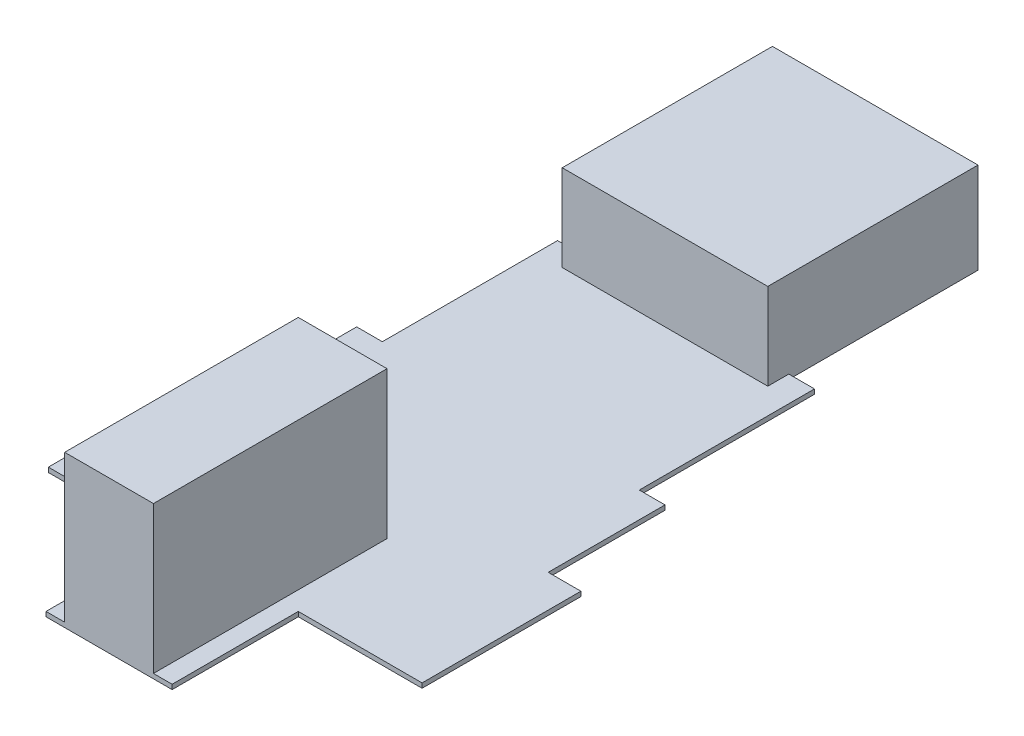
ISO-10303-21;
HEADER;
FILE_DESCRIPTION(('STEP AP214'),'2;1');
FILE_NAME('part.step','',(''),(''),'','','');
FILE_SCHEMA(('AUTOMOTIVE_DESIGN { 1 0 10303 214 1 1 1 1 }'));
ENDSEC;
DATA;
#1=APPLICATION_CONTEXT('core data for automotive mechanical design processes');
#2=APPLICATION_PROTOCOL_DEFINITION('international standard','automotive_design',2000,#1);
#3=PRODUCT_CONTEXT('',#1,'mechanical');
#4=PRODUCT('Part','Part','',(#3));
#5=PRODUCT_RELATED_PRODUCT_CATEGORY('part','',(#4));
#6=PRODUCT_DEFINITION_FORMATION('','',#4);
#7=PRODUCT_DEFINITION_CONTEXT('part definition',#1,'design');
#8=PRODUCT_DEFINITION('design','',#6,#7);
#9=PRODUCT_DEFINITION_SHAPE('','',#8);
#10=(LENGTH_UNIT() NAMED_UNIT(*) SI_UNIT(.MILLI.,.METRE.));
#11=(NAMED_UNIT(*) PLANE_ANGLE_UNIT() SI_UNIT($,.RADIAN.));
#12=(NAMED_UNIT(*) SI_UNIT($,.STERADIAN.) SOLID_ANGLE_UNIT());
#13=UNCERTAINTY_MEASURE_WITH_UNIT(LENGTH_MEASURE(1.E-05),#10,'distance_accuracy_value','');
#14=(GEOMETRIC_REPRESENTATION_CONTEXT(3) GLOBAL_UNCERTAINTY_ASSIGNED_CONTEXT((#13)) GLOBAL_UNIT_ASSIGNED_CONTEXT((#10,
#11,#12)) REPRESENTATION_CONTEXT('',''));
#15=CARTESIAN_POINT('',(0.,0.,0.));
#16=DIRECTION('',(0.,0.,1.));
#17=DIRECTION('',(1.,0.,0.));
#18=AXIS2_PLACEMENT_3D('',#15,#16,#17);
#19=CARTESIAN_POINT('',(0.,2.,0.));
#20=DIRECTION('',(0.,1.,0.));
#21=DIRECTION('',(0.,0.,1.));
#22=AXIS2_PLACEMENT_3D('',#19,#20,#21);
#23=PLANE('',#22);
#24=DIRECTION('',(0.,0.,-1.));
#25=VECTOR('',#24,1.);
#26=CARTESIAN_POINT('',(43.9999999999993,2.,-328.));
#27=LINE('',#26,#25);
#28=CARTESIAN_POINT('',(43.9999999999993,2.,-238.));
#29=VERTEX_POINT('',#28);
#30=CARTESIAN_POINT('',(43.9999999999994,2.,-247.));
#31=VERTEX_POINT('',#30);
#32=EDGE_CURVE('E52',#29,#31,#27,.T.);
#33=ORIENTED_EDGE('',*,*,#32,.F.);
#34=DIRECTION('',(-1.,0.,0.));
#35=VECTOR('',#34,1.);
#36=CARTESIAN_POINT('',(43.9999999999993,1.99999999999999,-238.));
#37=LINE('',#36,#35);
#38=CARTESIAN_POINT('',(-44.0000000000014,2.,-238.));
#39=VERTEX_POINT('',#38);
#40=EDGE_CURVE('E57',#29,#39,#37,.T.);
#41=ORIENTED_EDGE('',*,*,#40,.T.);
#42=DIRECTION('',(0.,0.,-1.));
#43=VECTOR('',#42,1.);
#44=CARTESIAN_POINT('',(-44.0000000000014,2.,-328.));
#45=LINE('',#44,#43);
#46=CARTESIAN_POINT('',(-44.0000000000014,1.99999999999999,-247.));
#47=VERTEX_POINT('',#46);
#48=EDGE_CURVE('E238',#39,#47,#45,.T.);
#49=ORIENTED_EDGE('',*,*,#48,.T.);
#50=DIRECTION('',(-1.,0.,0.));
#51=VECTOR('',#50,1.);
#52=CARTESIAN_POINT('',(-55.0000000000011,2.,-247.));
#53=LINE('',#52,#51);
#54=CARTESIAN_POINT('',(-55.0000000000011,2.,-247.));
#55=VERTEX_POINT('',#54);
#56=EDGE_CURVE('E407',#47,#55,#53,.T.);
#57=ORIENTED_EDGE('',*,*,#56,.T.);
#58=DIRECTION('',(0.,0.,1.));
#59=VECTOR('',#58,1.);
#60=CARTESIAN_POINT('',(-55.0000000000006,2.,-172.));
#61=LINE('',#60,#59);
#62=CARTESIAN_POINT('',(-55.0000000000006,2.,-172.));
#63=VERTEX_POINT('',#62);
#64=EDGE_CURVE('E367',#55,#63,#61,.T.);
#65=ORIENTED_EDGE('',*,*,#64,.T.);
#66=DIRECTION('',(-1.,0.,0.));
#67=VECTOR('',#66,1.);
#68=CARTESIAN_POINT('',(-66.0000000000006,2.,-172.));
#69=LINE('',#68,#67);
#70=CARTESIAN_POINT('',(-66.0000000000006,2.,-172.));
#71=VERTEX_POINT('',#70);
#72=EDGE_CURVE('E294',#63,#71,#69,.T.);
#73=ORIENTED_EDGE('',*,*,#72,.T.);
#74=DIRECTION('',(0.,0.,1.));
#75=VECTOR('',#74,1.);
#76=CARTESIAN_POINT('',(-66.0000000000004,2.,-122.));
#77=LINE('',#76,#75);
#78=CARTESIAN_POINT('',(-66.0000000000004,2.,-122.));
#79=VERTEX_POINT('',#78);
#80=EDGE_CURVE('E297',#71,#79,#77,.T.);
#81=ORIENTED_EDGE('',*,*,#80,.T.);
#82=DIRECTION('',(-1.,0.,0.));
#83=VECTOR('',#82,1.);
#84=CARTESIAN_POINT('',(-80.0000000000004,2.,-122.));
#85=LINE('',#84,#83);
#86=CARTESIAN_POINT('',(-80.0000000000004,2.,-122.));
#87=VERTEX_POINT('',#86);
#88=EDGE_CURVE('E300',#79,#87,#85,.T.);
#89=ORIENTED_EDGE('',*,*,#88,.T.);
#90=DIRECTION('',(0.,0.,1.));
#91=VECTOR('',#90,1.);
#92=CARTESIAN_POINT('',(-80.0000000000002,2.,-53.9999999999996));
#93=LINE('',#92,#91);
#94=CARTESIAN_POINT('',(-80.0000000000002,2.,-53.9999999999996));
#95=VERTEX_POINT('',#94);
#96=EDGE_CURVE('E302',#87,#95,#93,.T.);
#97=ORIENTED_EDGE('',*,*,#96,.T.);
#98=DIRECTION('',(1.,0.,0.));
#99=VECTOR('',#98,1.);
#100=CARTESIAN_POINT('',(-27.0000000000002,2.,-54.));
#101=LINE('',#100,#99);
#102=CARTESIAN_POINT('',(-27.0000000000002,2.,-54.));
#103=VERTEX_POINT('',#102);
#104=EDGE_CURVE('E304',#95,#103,#101,.T.);
#105=ORIENTED_EDGE('',*,*,#104,.T.);
#106=DIRECTION('',(0.,0.,1.));
#107=VECTOR('',#106,1.);
#108=CARTESIAN_POINT('',(-27.,2.,2.22044604925031E-13));
#109=LINE('',#108,#107);
#110=CARTESIAN_POINT('',(-27.,2.,2.22044604925031E-13));
#111=VERTEX_POINT('',#110);
#112=EDGE_CURVE('E306',#103,#111,#109,.T.);
#113=ORIENTED_EDGE('',*,*,#112,.T.);
#114=DIRECTION('',(1.,0.,0.));
#115=VECTOR('',#114,1.);
#116=CARTESIAN_POINT('',(-27.,2.,2.22044604925031E-13));
#117=LINE('',#116,#115);
#118=CARTESIAN_POINT('',(-19.,2.,1.89149107899101E-13));
#119=VERTEX_POINT('',#118);
#120=EDGE_CURVE('E263',#111,#119,#117,.T.);
#121=ORIENTED_EDGE('',*,*,#120,.T.);
#122=DIRECTION('',(0.,0.,-1.));
#123=VECTOR('',#122,1.);
#124=CARTESIAN_POINT('',(-19.,2.,0.));
#125=LINE('',#124,#123);
#126=CARTESIAN_POINT('',(-19.,2.,-100.));
#127=VERTEX_POINT('',#126);
#128=EDGE_CURVE('E253',#119,#127,#125,.T.);
#129=ORIENTED_EDGE('',*,*,#128,.T.);
#130=DIRECTION('',(-1.,0.,0.));
#131=VECTOR('',#130,1.);
#132=CARTESIAN_POINT('',(19.,2.,-100.));
#133=LINE('',#132,#131);
#134=CARTESIAN_POINT('',(19.,2.,-100.));
#135=VERTEX_POINT('',#134);
#136=EDGE_CURVE('E290',#135,#127,#133,.T.);
#137=ORIENTED_EDGE('',*,*,#136,.F.);
#138=DIRECTION('',(0.,0.,-1.));
#139=VECTOR('',#138,1.);
#140=CARTESIAN_POINT('',(19.,2.,0.));
#141=LINE('',#140,#139);
#142=CARTESIAN_POINT('',(19.,2.,0.));
#143=VERTEX_POINT('',#142);
#144=EDGE_CURVE('E282',#143,#135,#141,.T.);
#145=ORIENTED_EDGE('',*,*,#144,.F.);
#146=CARTESIAN_POINT('',(27.,2.,0.));
#147=VERTEX_POINT('',#146);
#148=EDGE_CURVE('E308',#143,#147,#117,.T.);
#149=ORIENTED_EDGE('',*,*,#148,.T.);
#150=DIRECTION('',(0.,0.,-1.));
#151=VECTOR('',#150,1.);
#152=CARTESIAN_POINT('',(27.,2.,0.));
#153=LINE('',#152,#151);
#154=CARTESIAN_POINT('',(26.9999999999998,2.,-54.));
#155=VERTEX_POINT('',#154);
#156=EDGE_CURVE('E311',#147,#155,#153,.T.);
#157=ORIENTED_EDGE('',*,*,#156,.T.);
#158=DIRECTION('',(1.,0.,0.));
#159=VECTOR('',#158,1.);
#160=CARTESIAN_POINT('',(26.9999999999998,2.,-54.));
#161=LINE('',#160,#159);
#162=CARTESIAN_POINT('',(79.9999999999998,2.,-54.));
#163=VERTEX_POINT('',#162);
#164=EDGE_CURVE('E420',#155,#163,#161,.T.);
#165=ORIENTED_EDGE('',*,*,#164,.T.);
#166=DIRECTION('',(0.,0.,-1.));
#167=VECTOR('',#166,1.);
#168=CARTESIAN_POINT('',(79.9999999999998,2.,-54.));
#169=LINE('',#168,#167);
#170=CARTESIAN_POINT('',(79.9999999999996,2.,-122.));
#171=VERTEX_POINT('',#170);
#172=EDGE_CURVE('E419',#163,#171,#169,.T.);
#173=ORIENTED_EDGE('',*,*,#172,.T.);
#174=DIRECTION('',(-1.,0.,0.));
#175=VECTOR('',#174,1.);
#176=CARTESIAN_POINT('',(79.9999999999996,2.,-122.));
#177=LINE('',#176,#175);
#178=CARTESIAN_POINT('',(65.9999999999996,2.,-122.));
#179=VERTEX_POINT('',#178);
#180=EDGE_CURVE('E417',#171,#179,#177,.T.);
#181=ORIENTED_EDGE('',*,*,#180,.T.);
#182=DIRECTION('',(0.,0.,-1.));
#183=VECTOR('',#182,1.);
#184=CARTESIAN_POINT('',(65.9999999999996,2.,-122.));
#185=LINE('',#184,#183);
#186=CARTESIAN_POINT('',(65.9999999999994,2.,-172.));
#187=VERTEX_POINT('',#186);
#188=EDGE_CURVE('E415',#179,#187,#185,.T.);
#189=ORIENTED_EDGE('',*,*,#188,.T.);
#190=DIRECTION('',(-1.,0.,0.));
#191=VECTOR('',#190,1.);
#192=CARTESIAN_POINT('',(65.9999999999994,2.,-172.));
#193=LINE('',#192,#191);
#194=CARTESIAN_POINT('',(54.9999999999994,2.,-172.));
#195=VERTEX_POINT('',#194);
#196=EDGE_CURVE('E413',#187,#195,#193,.T.);
#197=ORIENTED_EDGE('',*,*,#196,.T.);
#198=DIRECTION('',(0.,0.,-1.));
#199=VECTOR('',#198,1.);
#200=CARTESIAN_POINT('',(54.9999999999994,2.,-172.));
#201=LINE('',#200,#199);
#202=CARTESIAN_POINT('',(54.9999999999994,2.,-247.));
#203=VERTEX_POINT('',#202);
#204=EDGE_CURVE('E411',#195,#203,#201,.T.);
#205=ORIENTED_EDGE('',*,*,#204,.T.);
#206=DIRECTION('',(-1.,0.,0.));
#207=VECTOR('',#206,1.);
#208=CARTESIAN_POINT('',(54.9999999999994,2.,-247.));
#209=LINE('',#208,#207);
#210=EDGE_CURVE('E409',#203,#31,#209,.T.);
#211=ORIENTED_EDGE('',*,*,#210,.T.);
#212=EDGE_LOOP('',(#33,#41,#49,#57,#65,#73,#81,#89,#97,#105,#113,#121,#129,#137,#145,#149,#157,
#165,#173,#181,#189,#197,#205,#211));
#213=FACE_BOUND('',#212,.T.);
#214=ADVANCED_FACE('F35',(#213),#23,.T.);
#215=CARTESIAN_POINT('',(-66.0000000000006,2.,-172.));
#216=DIRECTION('',(0.,0.,1.));
#217=DIRECTION('',(1.,0.,0.));
#218=AXIS2_PLACEMENT_3D('',#215,#216,#217);
#219=PLANE('',#218);
#220=DIRECTION('',(-1.,0.,0.));
#221=VECTOR('',#220,1.);
#222=CARTESIAN_POINT('',(-66.0000000000006,0.,-172.));
#223=LINE('',#222,#221);
#224=CARTESIAN_POINT('',(-55.0000000000006,0.,-172.));
#225=VERTEX_POINT('',#224);
#226=CARTESIAN_POINT('',(-66.0000000000006,0.,-172.));
#227=VERTEX_POINT('',#226);
#228=EDGE_CURVE('E293',#225,#227,#223,.T.);
#229=ORIENTED_EDGE('',*,*,#228,.T.);
#230=DIRECTION('',(0.,-1.,0.));
#231=VECTOR('',#230,1.);
#232=CARTESIAN_POINT('',(-66.0000000000006,2.,-172.));
#233=LINE('',#232,#231);
#234=EDGE_CURVE('E11',#71,#227,#233,.T.);
#235=ORIENTED_EDGE('',*,*,#234,.F.);
#236=ORIENTED_EDGE('',*,*,#72,.F.);
#237=DIRECTION('',(0.,-1.,0.));
#238=VECTOR('',#237,1.);
#239=CARTESIAN_POINT('',(-55.0000000000006,2.,-172.));
#240=LINE('',#239,#238);
#241=EDGE_CURVE('E364',#63,#225,#240,.T.);
#242=ORIENTED_EDGE('',*,*,#241,.T.);
#243=EDGE_LOOP('',(#229,#235,#236,#242));
#244=FACE_BOUND('',#243,.T.);
#245=ADVANCED_FACE('F37',(#244),#219,.F.);
#246=CARTESIAN_POINT('',(-66.0000000000004,2.,-122.));
#247=DIRECTION('',(1.,0.,0.));
#248=DIRECTION('',(0.,0.,-1.));
#249=AXIS2_PLACEMENT_3D('',#246,#247,#248);
#250=PLANE('',#249);
#251=DIRECTION('',(0.,0.,1.));
#252=VECTOR('',#251,1.);
#253=CARTESIAN_POINT('',(-66.0000000000004,0.,-122.));
#254=LINE('',#253,#252);
#255=CARTESIAN_POINT('',(-66.0000000000004,0.,-122.));
#256=VERTEX_POINT('',#255);
#257=EDGE_CURVE('E402',#227,#256,#254,.T.);
#258=ORIENTED_EDGE('',*,*,#257,.T.);
#259=DIRECTION('',(0.,-1.,0.));
#260=VECTOR('',#259,1.);
#261=CARTESIAN_POINT('',(-66.0000000000004,2.,-122.));
#262=LINE('',#261,#260);
#263=EDGE_CURVE('E44',#79,#256,#262,.T.);
#264=ORIENTED_EDGE('',*,*,#263,.F.);
#265=ORIENTED_EDGE('',*,*,#80,.F.);
#266=ORIENTED_EDGE('',*,*,#234,.T.);
#267=EDGE_LOOP('',(#258,#264,#265,#266));
#268=FACE_BOUND('',#267,.T.);
#269=ADVANCED_FACE('F487',(#268),#250,.F.);
#270=CARTESIAN_POINT('',(-80.0000000000004,2.,-122.));
#271=DIRECTION('',(0.,0.,1.));
#272=DIRECTION('',(1.,0.,0.));
#273=AXIS2_PLACEMENT_3D('',#270,#271,#272);
#274=PLANE('',#273);
#275=DIRECTION('',(-1.,0.,0.));
#276=VECTOR('',#275,1.);
#277=CARTESIAN_POINT('',(-80.0000000000004,0.,-122.));
#278=LINE('',#277,#276);
#279=CARTESIAN_POINT('',(-80.0000000000004,0.,-122.));
#280=VERTEX_POINT('',#279);
#281=EDGE_CURVE('E400',#256,#280,#278,.T.);
#282=ORIENTED_EDGE('',*,*,#281,.T.);
#283=DIRECTION('',(0.,-1.,0.));
#284=VECTOR('',#283,1.);
#285=CARTESIAN_POINT('',(-80.0000000000004,2.,-122.));
#286=LINE('',#285,#284);
#287=EDGE_CURVE('E320',#87,#280,#286,.T.);
#288=ORIENTED_EDGE('',*,*,#287,.F.);
#289=ORIENTED_EDGE('',*,*,#88,.F.);
#290=ORIENTED_EDGE('',*,*,#263,.T.);
#291=EDGE_LOOP('',(#282,#288,#289,#290));
#292=FACE_BOUND('',#291,.T.);
#293=ADVANCED_FACE('F490',(#292),#274,.F.);
#294=CARTESIAN_POINT('',(-80.0000000000002,2.,-53.9999999999996));
#295=DIRECTION('',(1.,0.,0.));
#296=DIRECTION('',(0.,0.,-1.));
#297=AXIS2_PLACEMENT_3D('',#294,#295,#296);
#298=PLANE('',#297);
#299=DIRECTION('',(0.,0.,1.));
#300=VECTOR('',#299,1.);
#301=CARTESIAN_POINT('',(-80.0000000000002,0.,-53.9999999999996));
#302=LINE('',#301,#300);
#303=CARTESIAN_POINT('',(-80.0000000000002,0.,-53.9999999999996));
#304=VERTEX_POINT('',#303);
#305=EDGE_CURVE('E398',#280,#304,#302,.T.);
#306=ORIENTED_EDGE('',*,*,#305,.T.);
#307=DIRECTION('',(0.,-1.,0.));
#308=VECTOR('',#307,1.);
#309=CARTESIAN_POINT('',(-80.0000000000002,2.,-53.9999999999996));
#310=LINE('',#309,#308);
#311=EDGE_CURVE('E323',#95,#304,#310,.T.);
#312=ORIENTED_EDGE('',*,*,#311,.F.);
#313=ORIENTED_EDGE('',*,*,#96,.F.);
#314=ORIENTED_EDGE('',*,*,#287,.T.);
#315=EDGE_LOOP('',(#306,#312,#313,#314));
#316=FACE_BOUND('',#315,.T.);
#317=ADVANCED_FACE('F495',(#316),#298,.F.);
#318=CARTESIAN_POINT('',(-27.0000000000002,2.,-54.));
#319=DIRECTION('',(0.,0.,-1.));
#320=DIRECTION('',(-1.,0.,0.));
#321=AXIS2_PLACEMENT_3D('',#318,#319,#320);
#322=PLANE('',#321);
#323=DIRECTION('',(1.,0.,0.));
#324=VECTOR('',#323,1.);
#325=CARTESIAN_POINT('',(-27.0000000000002,0.,-54.));
#326=LINE('',#325,#324);
#327=CARTESIAN_POINT('',(-27.0000000000002,0.,-54.));
#328=VERTEX_POINT('',#327);
#329=EDGE_CURVE('E396',#304,#328,#326,.T.);
#330=ORIENTED_EDGE('',*,*,#329,.T.);
#331=DIRECTION('',(0.,-1.,0.));
#332=VECTOR('',#331,1.);
#333=CARTESIAN_POINT('',(-27.0000000000002,2.,-54.));
#334=LINE('',#333,#332);
#335=EDGE_CURVE('E326',#103,#328,#334,.T.);
#336=ORIENTED_EDGE('',*,*,#335,.F.);
#337=ORIENTED_EDGE('',*,*,#104,.F.);
#338=ORIENTED_EDGE('',*,*,#311,.T.);
#339=EDGE_LOOP('',(#330,#336,#337,#338));
#340=FACE_BOUND('',#339,.T.);
#341=ADVANCED_FACE('F501',(#340),#322,.F.);
#342=CARTESIAN_POINT('',(-27.,2.,2.22044604925031E-13));
#343=DIRECTION('',(1.,0.,0.));
#344=DIRECTION('',(0.,0.,-1.));
#345=AXIS2_PLACEMENT_3D('',#342,#343,#344);
#346=PLANE('',#345);
#347=DIRECTION('',(0.,0.,1.));
#348=VECTOR('',#347,1.);
#349=CARTESIAN_POINT('',(-27.,0.,2.22044604925031E-13));
#350=LINE('',#349,#348);
#351=CARTESIAN_POINT('',(-27.,0.,2.22044604925031E-13));
#352=VERTEX_POINT('',#351);
#353=EDGE_CURVE('E394',#328,#352,#350,.T.);
#354=ORIENTED_EDGE('',*,*,#353,.T.);
#355=DIRECTION('',(0.,-1.,0.));
#356=VECTOR('',#355,1.);
#357=CARTESIAN_POINT('',(-27.,2.,2.22044604925031E-13));
#358=LINE('',#357,#356);
#359=EDGE_CURVE('E329',#111,#352,#358,.T.);
#360=ORIENTED_EDGE('',*,*,#359,.F.);
#361=ORIENTED_EDGE('',*,*,#112,.F.);
#362=ORIENTED_EDGE('',*,*,#335,.T.);
#363=EDGE_LOOP('',(#354,#360,#361,#362));
#364=FACE_BOUND('',#363,.T.);
#365=ADVANCED_FACE('F505',(#364),#346,.F.);
#366=CARTESIAN_POINT('',(-27.,2.,2.22044604925031E-13));
#367=DIRECTION('',(0.,0.,-1.));
#368=DIRECTION('',(-1.,0.,0.));
#369=AXIS2_PLACEMENT_3D('',#366,#367,#368);
#370=PLANE('',#369);
#371=DIRECTION('',(1.,0.,0.));
#372=VECTOR('',#371,1.);
#373=CARTESIAN_POINT('',(-27.,0.,2.22044604925031E-13));
#374=LINE('',#373,#372);
#375=CARTESIAN_POINT('',(27.,0.,0.));
#376=VERTEX_POINT('',#375);
#377=EDGE_CURVE('E392',#352,#376,#374,.T.);
#378=ORIENTED_EDGE('',*,*,#377,.T.);
#379=DIRECTION('',(0.,-1.,0.));
#380=VECTOR('',#379,1.);
#381=CARTESIAN_POINT('',(27.,2.,0.));
#382=LINE('',#381,#380);
#383=EDGE_CURVE('E331',#147,#376,#382,.T.);
#384=ORIENTED_EDGE('',*,*,#383,.F.);
#385=ORIENTED_EDGE('',*,*,#148,.F.);
#386=DIRECTION('',(0.,-1.,0.));
#387=VECTOR('',#386,1.);
#388=CARTESIAN_POINT('',(19.,2.,0.));
#389=LINE('',#388,#387);
#390=CARTESIAN_POINT('',(19.,65.,0.));
#391=VERTEX_POINT('',#390);
#392=EDGE_CURVE('E280',#391,#143,#389,.T.);
#393=ORIENTED_EDGE('',*,*,#392,.F.);
#394=DIRECTION('',(-1.,0.,0.));
#395=VECTOR('',#394,1.);
#396=CARTESIAN_POINT('',(19.,65.,0.));
#397=LINE('',#396,#395);
#398=CARTESIAN_POINT('',(-19.,65.,0.));
#399=VERTEX_POINT('',#398);
#400=EDGE_CURVE('E266',#391,#399,#397,.T.);
#401=ORIENTED_EDGE('',*,*,#400,.T.);
#402=DIRECTION('',(0.,-1.,0.));
#403=VECTOR('',#402,1.);
#404=CARTESIAN_POINT('',(-19.,2.,0.));
#405=LINE('',#404,#403);
#406=EDGE_CURVE('E230',#399,#119,#405,.T.);
#407=ORIENTED_EDGE('',*,*,#406,.T.);
#408=ORIENTED_EDGE('',*,*,#120,.F.);
#409=ORIENTED_EDGE('',*,*,#359,.T.);
#410=EDGE_LOOP('',(#378,#384,#385,#393,#401,#407,#408,#409));
#411=FACE_BOUND('',#410,.T.);
#412=ADVANCED_FACE('F261',(#411),#370,.F.);
#413=CARTESIAN_POINT('',(27.,2.,0.));
#414=DIRECTION('',(-1.,0.,0.));
#415=DIRECTION('',(0.,0.,1.));
#416=AXIS2_PLACEMENT_3D('',#413,#414,#415);
#417=PLANE('',#416);
#418=DIRECTION('',(0.,0.,-1.));
#419=VECTOR('',#418,1.);
#420=CARTESIAN_POINT('',(27.,0.,0.));
#421=LINE('',#420,#419);
#422=CARTESIAN_POINT('',(26.9999999999998,0.,-54.));
#423=VERTEX_POINT('',#422);
#424=EDGE_CURVE('E390',#376,#423,#421,.T.);
#425=ORIENTED_EDGE('',*,*,#424,.T.);
#426=DIRECTION('',(0.,-1.,0.));
#427=VECTOR('',#426,1.);
#428=CARTESIAN_POINT('',(26.9999999999998,2.,-54.));
#429=LINE('',#428,#427);
#430=EDGE_CURVE('E334',#155,#423,#429,.T.);
#431=ORIENTED_EDGE('',*,*,#430,.F.);
#432=ORIENTED_EDGE('',*,*,#156,.F.);
#433=ORIENTED_EDGE('',*,*,#383,.T.);
#434=EDGE_LOOP('',(#425,#431,#432,#433));
#435=FACE_BOUND('',#434,.T.);
#436=ADVANCED_FACE('F428',(#435),#417,.F.);
#437=CARTESIAN_POINT('',(26.9999999999998,2.,-54.));
#438=DIRECTION('',(0.,0.,-1.));
#439=DIRECTION('',(-1.,0.,0.));
#440=AXIS2_PLACEMENT_3D('',#437,#438,#439);
#441=PLANE('',#440);
#442=DIRECTION('',(1.,0.,0.));
#443=VECTOR('',#442,1.);
#444=CARTESIAN_POINT('',(26.9999999999998,0.,-54.));
#445=LINE('',#444,#443);
#446=CARTESIAN_POINT('',(79.9999999999998,0.,-54.));
#447=VERTEX_POINT('',#446);
#448=EDGE_CURVE('E388',#423,#447,#445,.T.);
#449=ORIENTED_EDGE('',*,*,#448,.T.);
#450=DIRECTION('',(0.,-1.,0.));
#451=VECTOR('',#450,1.);
#452=CARTESIAN_POINT('',(79.9999999999998,2.,-54.));
#453=LINE('',#452,#451);
#454=EDGE_CURVE('E337',#163,#447,#453,.T.);
#455=ORIENTED_EDGE('',*,*,#454,.F.);
#456=ORIENTED_EDGE('',*,*,#164,.F.);
#457=ORIENTED_EDGE('',*,*,#430,.T.);
#458=EDGE_LOOP('',(#449,#455,#456,#457));
#459=FACE_BOUND('',#458,.T.);
#460=ADVANCED_FACE('F432',(#459),#441,.F.);
#461=CARTESIAN_POINT('',(79.9999999999998,2.,-54.));
#462=DIRECTION('',(-1.,0.,0.));
#463=DIRECTION('',(0.,0.,1.));
#464=AXIS2_PLACEMENT_3D('',#461,#462,#463);
#465=PLANE('',#464);
#466=DIRECTION('',(0.,0.,-1.));
#467=VECTOR('',#466,1.);
#468=CARTESIAN_POINT('',(79.9999999999998,0.,-54.));
#469=LINE('',#468,#467);
#470=CARTESIAN_POINT('',(79.9999999999996,0.,-122.));
#471=VERTEX_POINT('',#470);
#472=EDGE_CURVE('E386',#447,#471,#469,.T.);
#473=ORIENTED_EDGE('',*,*,#472,.T.);
#474=DIRECTION('',(0.,-1.,0.));
#475=VECTOR('',#474,1.);
#476=CARTESIAN_POINT('',(79.9999999999996,2.,-122.));
#477=LINE('',#476,#475);
#478=EDGE_CURVE('E340',#171,#471,#477,.T.);
#479=ORIENTED_EDGE('',*,*,#478,.F.);
#480=ORIENTED_EDGE('',*,*,#172,.F.);
#481=ORIENTED_EDGE('',*,*,#454,.T.);
#482=EDGE_LOOP('',(#473,#479,#480,#481));
#483=FACE_BOUND('',#482,.T.);
#484=ADVANCED_FACE('F437',(#483),#465,.F.);
#485=CARTESIAN_POINT('',(79.9999999999996,2.,-122.));
#486=DIRECTION('',(0.,0.,1.));
#487=DIRECTION('',(1.,0.,0.));
#488=AXIS2_PLACEMENT_3D('',#485,#486,#487);
#489=PLANE('',#488);
#490=DIRECTION('',(-1.,0.,0.));
#491=VECTOR('',#490,1.);
#492=CARTESIAN_POINT('',(79.9999999999996,0.,-122.));
#493=LINE('',#492,#491);
#494=CARTESIAN_POINT('',(65.9999999999996,0.,-122.));
#495=VERTEX_POINT('',#494);
#496=EDGE_CURVE('E384',#471,#495,#493,.T.);
#497=ORIENTED_EDGE('',*,*,#496,.T.);
#498=DIRECTION('',(0.,-1.,0.));
#499=VECTOR('',#498,1.);
#500=CARTESIAN_POINT('',(65.9999999999996,2.,-122.));
#501=LINE('',#500,#499);
#502=EDGE_CURVE('E343',#179,#495,#501,.T.);
#503=ORIENTED_EDGE('',*,*,#502,.F.);
#504=ORIENTED_EDGE('',*,*,#180,.F.);
#505=ORIENTED_EDGE('',*,*,#478,.T.);
#506=EDGE_LOOP('',(#497,#503,#504,#505));
#507=FACE_BOUND('',#506,.T.);
#508=ADVANCED_FACE('F443',(#507),#489,.F.);
#509=CARTESIAN_POINT('',(65.9999999999996,2.,-122.));
#510=DIRECTION('',(-1.,0.,0.));
#511=DIRECTION('',(0.,0.,1.));
#512=AXIS2_PLACEMENT_3D('',#509,#510,#511);
#513=PLANE('',#512);
#514=DIRECTION('',(0.,0.,-1.));
#515=VECTOR('',#514,1.);
#516=CARTESIAN_POINT('',(65.9999999999996,0.,-122.));
#517=LINE('',#516,#515);
#518=CARTESIAN_POINT('',(65.9999999999994,0.,-172.));
#519=VERTEX_POINT('',#518);
#520=EDGE_CURVE('E382',#495,#519,#517,.T.);
#521=ORIENTED_EDGE('',*,*,#520,.T.);
#522=DIRECTION('',(0.,-1.,0.));
#523=VECTOR('',#522,1.);
#524=CARTESIAN_POINT('',(65.9999999999994,2.,-172.));
#525=LINE('',#524,#523);
#526=EDGE_CURVE('E346',#187,#519,#525,.T.);
#527=ORIENTED_EDGE('',*,*,#526,.F.);
#528=ORIENTED_EDGE('',*,*,#188,.F.);
#529=ORIENTED_EDGE('',*,*,#502,.T.);
#530=EDGE_LOOP('',(#521,#527,#528,#529));
#531=FACE_BOUND('',#530,.T.);
#532=ADVANCED_FACE('F447',(#531),#513,.F.);
#533=CARTESIAN_POINT('',(65.9999999999994,2.,-172.));
#534=DIRECTION('',(0.,0.,1.));
#535=DIRECTION('',(1.,0.,0.));
#536=AXIS2_PLACEMENT_3D('',#533,#534,#535);
#537=PLANE('',#536);
#538=DIRECTION('',(-1.,0.,0.));
#539=VECTOR('',#538,1.);
#540=CARTESIAN_POINT('',(65.9999999999994,0.,-172.));
#541=LINE('',#540,#539);
#542=CARTESIAN_POINT('',(54.9999999999994,0.,-172.));
#543=VERTEX_POINT('',#542);
#544=EDGE_CURVE('E380',#519,#543,#541,.T.);
#545=ORIENTED_EDGE('',*,*,#544,.T.);
#546=DIRECTION('',(0.,-1.,0.));
#547=VECTOR('',#546,1.);
#548=CARTESIAN_POINT('',(54.9999999999994,2.,-172.));
#549=LINE('',#548,#547);
#550=EDGE_CURVE('E349',#195,#543,#549,.T.);
#551=ORIENTED_EDGE('',*,*,#550,.F.);
#552=ORIENTED_EDGE('',*,*,#196,.F.);
#553=ORIENTED_EDGE('',*,*,#526,.T.);
#554=EDGE_LOOP('',(#545,#551,#552,#553));
#555=FACE_BOUND('',#554,.T.);
#556=ADVANCED_FACE('F452',(#555),#537,.F.);
#557=CARTESIAN_POINT('',(54.9999999999994,2.,-172.));
#558=DIRECTION('',(-1.,0.,0.));
#559=DIRECTION('',(0.,0.,1.));
#560=AXIS2_PLACEMENT_3D('',#557,#558,#559);
#561=PLANE('',#560);
#562=DIRECTION('',(0.,0.,-1.));
#563=VECTOR('',#562,1.);
#564=CARTESIAN_POINT('',(54.9999999999994,0.,-172.));
#565=LINE('',#564,#563);
#566=CARTESIAN_POINT('',(54.9999999999994,0.,-247.));
#567=VERTEX_POINT('',#566);
#568=EDGE_CURVE('E378',#543,#567,#565,.T.);
#569=ORIENTED_EDGE('',*,*,#568,.T.);
#570=DIRECTION('',(0.,-1.,0.));
#571=VECTOR('',#570,1.);
#572=CARTESIAN_POINT('',(54.9999999999994,2.,-247.));
#573=LINE('',#572,#571);
#574=EDGE_CURVE('E352',#203,#567,#573,.T.);
#575=ORIENTED_EDGE('',*,*,#574,.F.);
#576=ORIENTED_EDGE('',*,*,#204,.F.);
#577=ORIENTED_EDGE('',*,*,#550,.T.);
#578=EDGE_LOOP('',(#569,#575,#576,#577));
#579=FACE_BOUND('',#578,.T.);
#580=ADVANCED_FACE('F458',(#579),#561,.F.);
#581=CARTESIAN_POINT('',(54.9999999999994,2.,-247.));
#582=DIRECTION('',(0.,0.,1.));
#583=DIRECTION('',(1.,0.,0.));
#584=AXIS2_PLACEMENT_3D('',#581,#582,#583);
#585=PLANE('',#584);
#586=DIRECTION('',(-1.,0.,0.));
#587=VECTOR('',#586,1.);
#588=CARTESIAN_POINT('',(54.9999999999994,0.,-247.));
#589=LINE('',#588,#587);
#590=CARTESIAN_POINT('',(43.9999999999994,0.,-247.));
#591=VERTEX_POINT('',#590);
#592=EDGE_CURVE('E376',#567,#591,#589,.T.);
#593=ORIENTED_EDGE('',*,*,#592,.T.);
#594=DIRECTION('',(0.,-1.,0.));
#595=VECTOR('',#594,1.);
#596=CARTESIAN_POINT('',(43.9999999999994,2.,-247.));
#597=LINE('',#596,#595);
#598=EDGE_CURVE('E355',#31,#591,#597,.T.);
#599=ORIENTED_EDGE('',*,*,#598,.F.);
#600=ORIENTED_EDGE('',*,*,#210,.F.);
#601=ORIENTED_EDGE('',*,*,#574,.T.);
#602=EDGE_LOOP('',(#593,#599,#600,#601));
#603=FACE_BOUND('',#602,.T.);
#604=ADVANCED_FACE('F462',(#603),#585,.F.);
#605=CARTESIAN_POINT('',(43.9999999999994,2.,-247.));
#606=DIRECTION('',(-1.,0.,0.));
#607=DIRECTION('',(0.,0.,1.));
#608=AXIS2_PLACEMENT_3D('',#605,#606,#607);
#609=PLANE('',#608);
#610=DIRECTION('',(0.,0.,-1.));
#611=VECTOR('',#610,1.);
#612=CARTESIAN_POINT('',(43.9999999999994,0.,-247.));
#613=LINE('',#612,#611);
#614=CARTESIAN_POINT('',(43.9999999999991,0.,-328.));
#615=VERTEX_POINT('',#614);
#616=EDGE_CURVE('E374',#591,#615,#613,.T.);
#617=ORIENTED_EDGE('',*,*,#616,.T.);
#618=DIRECTION('',(0.,-1.,0.));
#619=VECTOR('',#618,1.);
#620=CARTESIAN_POINT('',(43.9999999999991,2.,-328.));
#621=LINE('',#620,#619);
#622=CARTESIAN_POINT('',(43.9999999999993,39.,-328.));
#623=VERTEX_POINT('',#622);
#624=EDGE_CURVE('E220',#623,#615,#621,.T.);
#625=ORIENTED_EDGE('',*,*,#624,.F.);
#626=DIRECTION('',(0.,0.,1.));
#627=VECTOR('',#626,1.);
#628=CARTESIAN_POINT('',(43.9999999999993,39.,-328.));
#629=LINE('',#628,#627);
#630=CARTESIAN_POINT('',(43.9999999999993,39.,-238.));
#631=VERTEX_POINT('',#630);
#632=EDGE_CURVE('E229',#623,#631,#629,.T.);
#633=ORIENTED_EDGE('',*,*,#632,.T.);
#634=DIRECTION('',(0.,-1.,0.));
#635=VECTOR('',#634,1.);
#636=CARTESIAN_POINT('',(43.9999999999993,1.99999999999999,-238.));
#637=LINE('',#636,#635);
#638=EDGE_CURVE('E243',#631,#29,#637,.T.);
#639=ORIENTED_EDGE('',*,*,#638,.T.);
#640=ORIENTED_EDGE('',*,*,#32,.T.);
#641=ORIENTED_EDGE('',*,*,#598,.T.);
#642=EDGE_LOOP('',(#617,#625,#633,#639,#640,#641));
#643=FACE_BOUND('',#642,.T.);
#644=ADVANCED_FACE('F465',(#643),#609,.F.);
#645=CARTESIAN_POINT('',(43.9999999999991,2.,-328.));
#646=DIRECTION('',(0.,0.,1.));
#647=DIRECTION('',(1.,0.,0.));
#648=AXIS2_PLACEMENT_3D('',#645,#646,#647);
#649=PLANE('',#648);
#650=DIRECTION('',(-1.,0.,0.));
#651=VECTOR('',#650,1.);
#652=CARTESIAN_POINT('',(43.9999999999991,0.,-328.));
#653=LINE('',#652,#651);
#654=CARTESIAN_POINT('',(-44.0000000000014,0.,-328.));
#655=VERTEX_POINT('',#654);
#656=EDGE_CURVE('E216',#615,#655,#653,.T.);
#657=ORIENTED_EDGE('',*,*,#656,.T.);
#658=DIRECTION('',(0.,-1.,0.));
#659=VECTOR('',#658,1.);
#660=CARTESIAN_POINT('',(-44.0000000000014,2.,-328.));
#661=LINE('',#660,#659);
#662=CARTESIAN_POINT('',(-44.0000000000014,39.,-328.));
#663=VERTEX_POINT('',#662);
#664=EDGE_CURVE('E210',#663,#655,#661,.T.);
#665=ORIENTED_EDGE('',*,*,#664,.F.);
#666=DIRECTION('',(-1.,0.,0.));
#667=VECTOR('',#666,1.);
#668=CARTESIAN_POINT('',(43.9999999999993,39.,-328.));
#669=LINE('',#668,#667);
#670=EDGE_CURVE('E214',#623,#663,#669,.T.);
#671=ORIENTED_EDGE('',*,*,#670,.F.);
#672=ORIENTED_EDGE('',*,*,#624,.T.);
#673=EDGE_LOOP('',(#657,#665,#671,#672));
#674=FACE_BOUND('',#673,.T.);
#675=ADVANCED_FACE('F212',(#674),#649,.F.);
#676=CARTESIAN_POINT('',(-44.0000000000011,2.,-247.));
#677=DIRECTION('',(1.,0.,0.));
#678=DIRECTION('',(0.,0.,-1.));
#679=AXIS2_PLACEMENT_3D('',#676,#677,#678);
#680=PLANE('',#679);
#681=DIRECTION('',(0.,0.,1.));
#682=VECTOR('',#681,1.);
#683=CARTESIAN_POINT('',(-44.0000000000011,0.,-247.));
#684=LINE('',#683,#682);
#685=CARTESIAN_POINT('',(-44.0000000000011,0.,-247.));
#686=VERTEX_POINT('',#685);
#687=EDGE_CURVE('E371',#655,#686,#684,.T.);
#688=ORIENTED_EDGE('',*,*,#687,.T.);
#689=DIRECTION('',(0.,-1.,0.));
#690=VECTOR('',#689,1.);
#691=CARTESIAN_POINT('',(-44.0000000000011,2.,-247.));
#692=LINE('',#691,#690);
#693=EDGE_CURVE('E221',#47,#686,#692,.T.);
#694=ORIENTED_EDGE('',*,*,#693,.F.);
#695=ORIENTED_EDGE('',*,*,#48,.F.);
#696=DIRECTION('',(0.,-1.,0.));
#697=VECTOR('',#696,1.);
#698=CARTESIAN_POINT('',(-44.0000000000014,1.99999999999999,-238.));
#699=LINE('',#698,#697);
#700=CARTESIAN_POINT('',(-44.0000000000014,39.,-238.));
#701=VERTEX_POINT('',#700);
#702=EDGE_CURVE('E236',#701,#39,#699,.T.);
#703=ORIENTED_EDGE('',*,*,#702,.F.);
#704=DIRECTION('',(0.,0.,1.));
#705=VECTOR('',#704,1.);
#706=CARTESIAN_POINT('',(-44.0000000000014,39.,-328.));
#707=LINE('',#706,#705);
#708=EDGE_CURVE('E228',#663,#701,#707,.T.);
#709=ORIENTED_EDGE('',*,*,#708,.F.);
#710=ORIENTED_EDGE('',*,*,#664,.T.);
#711=EDGE_LOOP('',(#688,#694,#695,#703,#709,#710));
#712=FACE_BOUND('',#711,.T.);
#713=ADVANCED_FACE('F234',(#712),#680,.F.);
#714=CARTESIAN_POINT('',(-55.0000000000011,2.,-247.));
#715=DIRECTION('',(0.,0.,1.));
#716=DIRECTION('',(1.,0.,0.));
#717=AXIS2_PLACEMENT_3D('',#714,#715,#716);
#718=PLANE('',#717);
#719=DIRECTION('',(-1.,0.,0.));
#720=VECTOR('',#719,1.);
#721=CARTESIAN_POINT('',(-55.0000000000011,0.,-247.));
#722=LINE('',#721,#720);
#723=CARTESIAN_POINT('',(-55.0000000000011,0.,-247.));
#724=VERTEX_POINT('',#723);
#725=EDGE_CURVE('E369',#686,#724,#722,.T.);
#726=ORIENTED_EDGE('',*,*,#725,.T.);
#727=DIRECTION('',(0.,-1.,0.));
#728=VECTOR('',#727,1.);
#729=CARTESIAN_POINT('',(-55.0000000000011,2.,-247.));
#730=LINE('',#729,#728);
#731=EDGE_CURVE('E361',#55,#724,#730,.T.);
#732=ORIENTED_EDGE('',*,*,#731,.F.);
#733=ORIENTED_EDGE('',*,*,#56,.F.);
#734=ORIENTED_EDGE('',*,*,#693,.T.);
#735=EDGE_LOOP('',(#726,#732,#733,#734));
#736=FACE_BOUND('',#735,.T.);
#737=ADVANCED_FACE('F474',(#736),#718,.F.);
#738=CARTESIAN_POINT('',(-55.0000000000006,2.,-172.));
#739=DIRECTION('',(1.,0.,0.));
#740=DIRECTION('',(0.,0.,-1.));
#741=AXIS2_PLACEMENT_3D('',#738,#739,#740);
#742=PLANE('',#741);
#743=DIRECTION('',(0.,0.,1.));
#744=VECTOR('',#743,1.);
#745=CARTESIAN_POINT('',(-55.0000000000006,0.,-172.));
#746=LINE('',#745,#744);
#747=EDGE_CURVE('E298',#724,#225,#746,.T.);
#748=ORIENTED_EDGE('',*,*,#747,.T.);
#749=ORIENTED_EDGE('',*,*,#241,.F.);
#750=ORIENTED_EDGE('',*,*,#64,.F.);
#751=ORIENTED_EDGE('',*,*,#731,.T.);
#752=EDGE_LOOP('',(#748,#749,#750,#751));
#753=FACE_BOUND('',#752,.T.);
#754=ADVANCED_FACE('F478',(#753),#742,.F.);
#755=CARTESIAN_POINT('',(0.,0.,0.));
#756=DIRECTION('',(0.,1.,0.));
#757=DIRECTION('',(0.,0.,1.));
#758=AXIS2_PLACEMENT_3D('',#755,#756,#757);
#759=PLANE('',#758);
#760=ORIENTED_EDGE('',*,*,#228,.F.);
#761=ORIENTED_EDGE('',*,*,#747,.F.);
#762=ORIENTED_EDGE('',*,*,#725,.F.);
#763=ORIENTED_EDGE('',*,*,#687,.F.);
#764=ORIENTED_EDGE('',*,*,#656,.F.);
#765=ORIENTED_EDGE('',*,*,#616,.F.);
#766=ORIENTED_EDGE('',*,*,#592,.F.);
#767=ORIENTED_EDGE('',*,*,#568,.F.);
#768=ORIENTED_EDGE('',*,*,#544,.F.);
#769=ORIENTED_EDGE('',*,*,#520,.F.);
#770=ORIENTED_EDGE('',*,*,#496,.F.);
#771=ORIENTED_EDGE('',*,*,#472,.F.);
#772=ORIENTED_EDGE('',*,*,#448,.F.);
#773=ORIENTED_EDGE('',*,*,#424,.F.);
#774=ORIENTED_EDGE('',*,*,#377,.F.);
#775=ORIENTED_EDGE('',*,*,#353,.F.);
#776=ORIENTED_EDGE('',*,*,#329,.F.);
#777=ORIENTED_EDGE('',*,*,#305,.F.);
#778=ORIENTED_EDGE('',*,*,#281,.F.);
#779=ORIENTED_EDGE('',*,*,#257,.F.);
#780=EDGE_LOOP('',(#760,#761,#762,#763,#764,#765,#766,#767,#768,#769,#770,#771,#772,#773,#774,
#775,#776,#777,#778,#779));
#781=FACE_BOUND('',#780,.T.);
#782=ADVANCED_FACE('F508',(#781),#759,.F.);
#783=CARTESIAN_POINT('',(19.,2.,-100.));
#784=DIRECTION('',(0.,0.,1.));
#785=DIRECTION('',(1.,0.,0.));
#786=AXIS2_PLACEMENT_3D('',#783,#784,#785);
#787=PLANE('',#786);
#788=ORIENTED_EDGE('',*,*,#136,.T.);
#789=DIRECTION('',(0.,1.,0.));
#790=VECTOR('',#789,1.);
#791=CARTESIAN_POINT('',(-19.,2.,-100.));
#792=LINE('',#791,#790);
#793=CARTESIAN_POINT('',(-19.,65.,-100.));
#794=VERTEX_POINT('',#793);
#795=EDGE_CURVE('E250',#127,#794,#792,.T.);
#796=ORIENTED_EDGE('',*,*,#795,.T.);
#797=DIRECTION('',(-1.,0.,0.));
#798=VECTOR('',#797,1.);
#799=CARTESIAN_POINT('',(19.,65.,-100.));
#800=LINE('',#799,#798);
#801=CARTESIAN_POINT('',(19.,65.,-100.));
#802=VERTEX_POINT('',#801);
#803=EDGE_CURVE('E278',#802,#794,#800,.T.);
#804=ORIENTED_EDGE('',*,*,#803,.F.);
#805=DIRECTION('',(0.,1.,0.));
#806=VECTOR('',#805,1.);
#807=CARTESIAN_POINT('',(19.,2.,-100.));
#808=LINE('',#807,#806);
#809=EDGE_CURVE('E284',#135,#802,#808,.T.);
#810=ORIENTED_EDGE('',*,*,#809,.F.);
#811=EDGE_LOOP('',(#788,#796,#804,#810));
#812=FACE_BOUND('',#811,.T.);
#813=ADVANCED_FACE('F510',(#812),#787,.F.);
#814=CARTESIAN_POINT('',(19.,65.,0.));
#815=DIRECTION('',(0.,-1.,0.));
#816=DIRECTION('',(0.,0.,-1.));
#817=AXIS2_PLACEMENT_3D('',#814,#815,#816);
#818=PLANE('',#817);
#819=ORIENTED_EDGE('',*,*,#803,.T.);
#820=DIRECTION('',(0.,0.,1.));
#821=VECTOR('',#820,1.);
#822=CARTESIAN_POINT('',(-19.,65.,0.));
#823=LINE('',#822,#821);
#824=EDGE_CURVE('E273',#794,#399,#823,.T.);
#825=ORIENTED_EDGE('',*,*,#824,.T.);
#826=ORIENTED_EDGE('',*,*,#400,.F.);
#827=DIRECTION('',(0.,0.,1.));
#828=VECTOR('',#827,1.);
#829=CARTESIAN_POINT('',(19.,65.,0.));
#830=LINE('',#829,#828);
#831=EDGE_CURVE('E286',#802,#391,#830,.T.);
#832=ORIENTED_EDGE('',*,*,#831,.F.);
#833=EDGE_LOOP('',(#819,#825,#826,#832));
#834=FACE_BOUND('',#833,.T.);
#835=ADVANCED_FACE('F275',(#834),#818,.F.);
#836=CARTESIAN_POINT('',(19.,0.,0.));
#837=DIRECTION('',(-1.,0.,0.));
#838=DIRECTION('',(0.,0.,1.));
#839=AXIS2_PLACEMENT_3D('',#836,#837,#838);
#840=PLANE('',#839);
#841=ORIENTED_EDGE('',*,*,#392,.T.);
#842=ORIENTED_EDGE('',*,*,#144,.T.);
#843=ORIENTED_EDGE('',*,*,#809,.T.);
#844=ORIENTED_EDGE('',*,*,#831,.T.);
#845=EDGE_LOOP('',(#841,#842,#843,#844));
#846=FACE_BOUND('',#845,.T.);
#847=ADVANCED_FACE('F527',(#846),#840,.F.);
#848=CARTESIAN_POINT('',(-19.,0.,0.));
#849=DIRECTION('',(-1.,0.,0.));
#850=DIRECTION('',(0.,0.,1.));
#851=AXIS2_PLACEMENT_3D('',#848,#849,#850);
#852=PLANE('',#851);
#853=ORIENTED_EDGE('',*,*,#406,.F.);
#854=ORIENTED_EDGE('',*,*,#824,.F.);
#855=ORIENTED_EDGE('',*,*,#795,.F.);
#856=ORIENTED_EDGE('',*,*,#128,.F.);
#857=EDGE_LOOP('',(#853,#854,#855,#856));
#858=FACE_BOUND('',#857,.T.);
#859=ADVANCED_FACE('F271',(#858),#852,.T.);
#860=CARTESIAN_POINT('',(43.9999999999993,39.,-328.));
#861=DIRECTION('',(0.,-1.,0.));
#862=DIRECTION('',(0.,0.,-1.));
#863=AXIS2_PLACEMENT_3D('',#860,#861,#862);
#864=PLANE('',#863);
#865=ORIENTED_EDGE('',*,*,#670,.T.);
#866=ORIENTED_EDGE('',*,*,#708,.T.);
#867=DIRECTION('',(-1.,0.,0.));
#868=VECTOR('',#867,1.);
#869=CARTESIAN_POINT('',(43.9999999999993,39.,-238.));
#870=LINE('',#869,#868);
#871=EDGE_CURVE('E231',#631,#701,#870,.T.);
#872=ORIENTED_EDGE('',*,*,#871,.F.);
#873=ORIENTED_EDGE('',*,*,#632,.F.);
#874=EDGE_LOOP('',(#865,#866,#872,#873));
#875=FACE_BOUND('',#874,.T.);
#876=ADVANCED_FACE('F226',(#875),#864,.F.);
#877=CARTESIAN_POINT('',(43.9999999999993,1.99999999999999,-238.));
#878=DIRECTION('',(0.,0.,-1.));
#879=DIRECTION('',(-1.,0.,0.));
#880=AXIS2_PLACEMENT_3D('',#877,#878,#879);
#881=PLANE('',#880);
#882=ORIENTED_EDGE('',*,*,#871,.T.);
#883=ORIENTED_EDGE('',*,*,#702,.T.);
#884=ORIENTED_EDGE('',*,*,#40,.F.);
#885=ORIENTED_EDGE('',*,*,#638,.F.);
#886=EDGE_LOOP('',(#882,#883,#884,#885));
#887=FACE_BOUND('',#886,.T.);
#888=ADVANCED_FACE('F468',(#887),#881,.F.);
#889=CLOSED_SHELL('',(#214,#245,#269,#293,#317,#341,#365,#412,#436,#460,#484,#508,#532,#556,
#580,#604,#644,#675,#713,#737,#754,#782,#813,#835,#847,#859,#876,#888));
#890=MANIFOLD_SOLID_BREP('B2',#889);
#891=ADVANCED_BREP_SHAPE_REPRESENTATION('',(#18,#890),#14);
#892=SHAPE_DEFINITION_REPRESENTATION(#9,#891);
ENDSEC;
END-ISO-10303-21;
